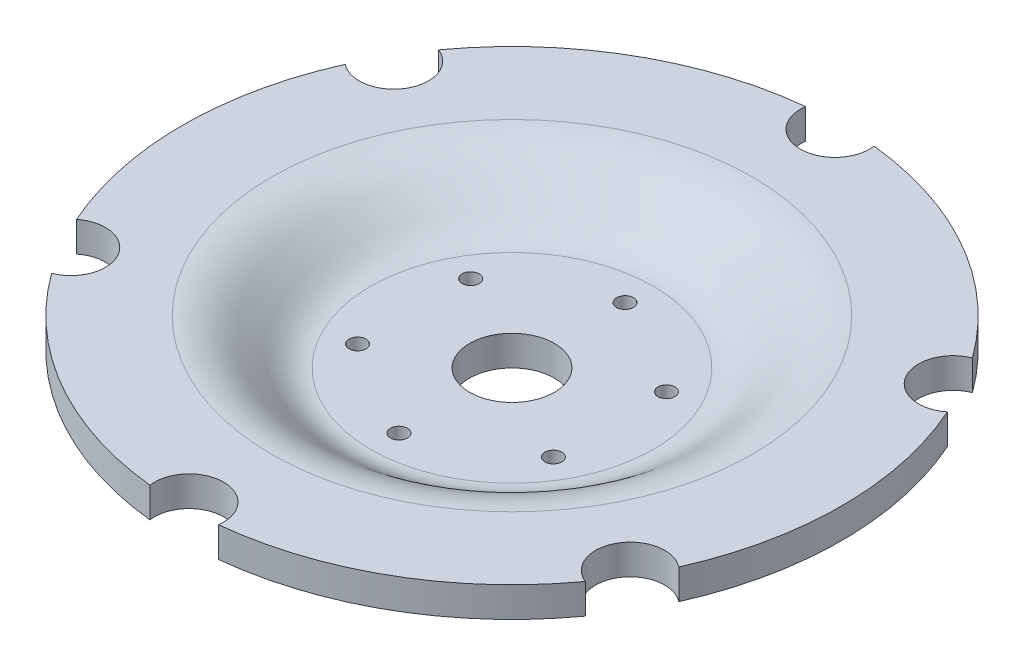
ISO-10303-21;
HEADER;
FILE_DESCRIPTION(('STEP AP214'),'2;1');
FILE_NAME('part.step','',(''),(''),'','','');
FILE_SCHEMA(('AUTOMOTIVE_DESIGN { 1 0 10303 214 1 1 1 1 }'));
ENDSEC;
DATA;
#1=APPLICATION_CONTEXT('core data for automotive mechanical design processes');
#2=APPLICATION_PROTOCOL_DEFINITION('international standard','automotive_design',2000,#1);
#3=PRODUCT_CONTEXT('',#1,'mechanical');
#4=PRODUCT('Part','Part','',(#3));
#5=PRODUCT_RELATED_PRODUCT_CATEGORY('part','',(#4));
#6=PRODUCT_DEFINITION_FORMATION('','',#4);
#7=PRODUCT_DEFINITION_CONTEXT('part definition',#1,'design');
#8=PRODUCT_DEFINITION('design','',#6,#7);
#9=PRODUCT_DEFINITION_SHAPE('','',#8);
#10=(LENGTH_UNIT() NAMED_UNIT(*) SI_UNIT(.MILLI.,.METRE.));
#11=(NAMED_UNIT(*) PLANE_ANGLE_UNIT() SI_UNIT($,.RADIAN.));
#12=(NAMED_UNIT(*) SI_UNIT($,.STERADIAN.) SOLID_ANGLE_UNIT());
#13=UNCERTAINTY_MEASURE_WITH_UNIT(LENGTH_MEASURE(1.E-05),#10,'distance_accuracy_value','');
#14=(GEOMETRIC_REPRESENTATION_CONTEXT(3) GLOBAL_UNCERTAINTY_ASSIGNED_CONTEXT((#13)) GLOBAL_UNIT_ASSIGNED_CONTEXT((#10,
#11,#12)) REPRESENTATION_CONTEXT('',''));
#15=CARTESIAN_POINT('',(0.,0.,0.));
#16=DIRECTION('',(0.,0.,1.));
#17=DIRECTION('',(1.,0.,0.));
#18=AXIS2_PLACEMENT_3D('',#15,#16,#17);
#19=CARTESIAN_POINT('',(0.,-15.0433244229354,0.));
#20=DIRECTION('',(0.,1.,0.));
#21=DIRECTION('',(0.,0.,1.));
#22=AXIS2_PLACEMENT_3D('',#19,#20,#21);
#23=CYLINDRICAL_SURFACE('',#22,109.626011544447);
#24=DIRECTION('',(0.,1.,0.));
#25=VECTOR('',#24,1.);
#26=CARTESIAN_POINT('',(-100.116479710272,-8.76000000000002,-44.6604175704388));
#27=LINE('',#26,#25);
#28=CARTESIAN_POINT('',(-100.116479710272,-6.24000000000001,-44.6604175704389));
#29=VERTEX_POINT('',#28);
#30=CARTESIAN_POINT('',(-100.116479710272,3.75999999999999,-44.6604175704389));
#31=VERTEX_POINT('',#30);
#32=EDGE_CURVE('E55',#29,#31,#27,.T.);
#33=ORIENTED_EDGE('',*,*,#32,.F.);
#34=CARTESIAN_POINT('',(0.,-6.24,0.));
#35=DIRECTION('',(0.,1.,0.));
#36=DIRECTION('',(0.,0.,1.));
#37=AXIS2_PLACEMENT_3D('',#34,#35,#36);
#38=CIRCLE('',#37,109.626011544447);
#39=CARTESIAN_POINT('',(-100.11647971027,-6.24,44.6604175704429));
#40=VERTEX_POINT('',#39);
#41=EDGE_CURVE('E167',#29,#40,#38,.T.);
#42=ORIENTED_EDGE('',*,*,#41,.T.);
#43=DIRECTION('',(0.,1.,0.));
#44=VECTOR('',#43,1.);
#45=CARTESIAN_POINT('',(-100.11647971027,-8.76,44.6604175704429));
#46=LINE('',#45,#44);
#47=CARTESIAN_POINT('',(-100.11647971027,3.76000000000001,44.6604175704429));
#48=VERTEX_POINT('',#47);
#49=EDGE_CURVE('E201',#48,#40,#46,.F.);
#50=ORIENTED_EDGE('',*,*,#49,.F.);
#51=CARTESIAN_POINT('',(0.,3.76,0.));
#52=DIRECTION('',(0.,1.,0.));
#53=DIRECTION('',(0.,0.,1.));
#54=AXIS2_PLACEMENT_3D('',#51,#52,#53);
#55=CIRCLE('',#54,109.626011544447);
#56=EDGE_CURVE('E150',#31,#48,#55,.T.);
#57=ORIENTED_EDGE('',*,*,#56,.F.);
#58=EDGE_LOOP('',(#33,#42,#50,#57));
#59=FACE_BOUND('',#58,.T.);
#60=ADVANCED_FACE('F41',(#59),#23,.T.);
#61=DIRECTION('',(0.,1.,0.));
#62=VECTOR('',#61,1.);
#63=CARTESIAN_POINT('',(100.116479710273,-8.76,44.6604175704364));
#64=LINE('',#63,#62);
#65=CARTESIAN_POINT('',(100.116479710273,-6.23999999999999,44.6604175704365));
#66=VERTEX_POINT('',#65);
#67=CARTESIAN_POINT('',(100.116479710273,3.76000000000001,44.6604175704365));
#68=VERTEX_POINT('',#67);
#69=EDGE_CURVE('E63',#66,#68,#64,.T.);
#70=ORIENTED_EDGE('',*,*,#69,.F.);
#71=CARTESIAN_POINT('',(100.116479710271,-6.24000000000001,-44.6604175704404));
#72=VERTEX_POINT('',#71);
#73=EDGE_CURVE('E187',#66,#72,#38,.T.);
#74=ORIENTED_EDGE('',*,*,#73,.T.);
#75=DIRECTION('',(0.,1.,0.));
#76=VECTOR('',#75,1.);
#77=CARTESIAN_POINT('',(100.116479710271,-8.76000000000002,-44.6604175704404));
#78=LINE('',#77,#76);
#79=CARTESIAN_POINT('',(100.116479710271,3.75999999999999,-44.6604175704404));
#80=VERTEX_POINT('',#79);
#81=EDGE_CURVE('E179',#80,#72,#78,.F.);
#82=ORIENTED_EDGE('',*,*,#81,.F.);
#83=EDGE_CURVE('E153',#68,#80,#55,.T.);
#84=ORIENTED_EDGE('',*,*,#83,.F.);
#85=EDGE_LOOP('',(#70,#74,#82,#84));
#86=FACE_BOUND('',#85,.T.);
#87=ADVANCED_FACE('F185',(#86),#23,.T.);
#88=DIRECTION('',(0.,1.,0.));
#89=VECTOR('',#88,1.);
#90=CARTESIAN_POINT('',(88.7352960147567,-8.76000000000002,-64.3732059813459));
#91=LINE('',#90,#89);
#92=CARTESIAN_POINT('',(88.7352960147567,-6.24000000000001,-64.3732059813458));
#93=VERTEX_POINT('',#92);
#94=CARTESIAN_POINT('',(88.7352960147567,3.75999999999999,-64.3732059813458));
#95=VERTEX_POINT('',#94);
#96=EDGE_CURVE('E182',#93,#95,#91,.T.);
#97=ORIENTED_EDGE('',*,*,#96,.F.);
#98=CARTESIAN_POINT('',(11.3811836955142,-6.24000000000002,-109.033623551784));
#99=VERTEX_POINT('',#98);
#100=EDGE_CURVE('E271',#93,#99,#38,.T.);
#101=ORIENTED_EDGE('',*,*,#100,.T.);
#102=DIRECTION('',(0.,1.,0.));
#103=VECTOR('',#102,1.);
#104=CARTESIAN_POINT('',(11.3811836955142,-8.76000000000003,-109.033623551784));
#105=LINE('',#104,#103);
#106=CARTESIAN_POINT('',(11.3811836955142,3.75999999999998,-109.033623551784));
#107=VERTEX_POINT('',#106);
#108=EDGE_CURVE('E282',#107,#99,#105,.F.);
#109=ORIENTED_EDGE('',*,*,#108,.F.);
#110=EDGE_CURVE('E149',#95,#107,#55,.T.);
#111=ORIENTED_EDGE('',*,*,#110,.F.);
#112=EDGE_LOOP('',(#97,#101,#109,#111));
#113=FACE_BOUND('',#112,.T.);
#114=ADVANCED_FACE('F264',(#113),#23,.T.);
#115=DIRECTION('',(0.,1.,0.));
#116=VECTOR('',#115,1.);
#117=CARTESIAN_POINT('',(-88.7352960147583,-8.76000000000002,-64.3732059813435));
#118=LINE('',#117,#116);
#119=CARTESIAN_POINT('',(-88.7352960147583,3.75999999999999,-64.3732059813435));
#120=VERTEX_POINT('',#119);
#121=CARTESIAN_POINT('',(-88.7352960147583,-6.24000000000001,-64.3732059813436));
#122=VERTEX_POINT('',#121);
#123=EDGE_CURVE('E128',#120,#122,#118,.F.);
#124=ORIENTED_EDGE('',*,*,#123,.F.);
#125=CARTESIAN_POINT('',(-11.3811836955142,3.75999999999998,-109.033623551784));
#126=VERTEX_POINT('',#125);
#127=EDGE_CURVE('E138',#126,#120,#55,.T.);
#128=ORIENTED_EDGE('',*,*,#127,.F.);
#129=DIRECTION('',(0.,1.,0.));
#130=VECTOR('',#129,1.);
#131=CARTESIAN_POINT('',(-11.3811836955142,-8.76000000000003,-109.033623551784));
#132=LINE('',#131,#130);
#133=CARTESIAN_POINT('',(-11.3811836955142,-6.24000000000002,-109.033623551784));
#134=VERTEX_POINT('',#133);
#135=EDGE_CURVE('E183',#134,#126,#132,.T.);
#136=ORIENTED_EDGE('',*,*,#135,.F.);
#137=EDGE_CURVE('E140',#134,#122,#38,.T.);
#138=ORIENTED_EDGE('',*,*,#137,.T.);
#139=EDGE_LOOP('',(#124,#128,#136,#138));
#140=FACE_BOUND('',#139,.T.);
#141=ADVANCED_FACE('F136',(#140),#23,.T.);
#142=DIRECTION('',(0.,1.,0.));
#143=VECTOR('',#142,1.);
#144=CARTESIAN_POINT('',(-88.7352960147557,-8.76,64.3732059813472));
#145=LINE('',#144,#143);
#146=CARTESIAN_POINT('',(-88.7352960147557,-6.23999999999999,64.3732059813472));
#147=VERTEX_POINT('',#146);
#148=CARTESIAN_POINT('',(-88.7352960147557,3.76000000000001,64.3732059813472));
#149=VERTEX_POINT('',#148);
#150=EDGE_CURVE('E206',#147,#149,#145,.T.);
#151=ORIENTED_EDGE('',*,*,#150,.F.);
#152=CARTESIAN_POINT('',(-11.3811836954952,-6.23999999999998,109.033623551786));
#153=VERTEX_POINT('',#152);
#154=EDGE_CURVE('E165',#147,#153,#38,.T.);
#155=ORIENTED_EDGE('',*,*,#154,.T.);
#156=DIRECTION('',(0.,1.,0.));
#157=VECTOR('',#156,1.);
#158=CARTESIAN_POINT('',(-11.3811836954952,-8.75999999999999,109.033623551786));
#159=LINE('',#158,#157);
#160=CARTESIAN_POINT('',(-11.3811836954952,3.76000000000002,109.033623551786));
#161=VERTEX_POINT('',#160);
#162=EDGE_CURVE('E210',#161,#153,#159,.F.);
#163=ORIENTED_EDGE('',*,*,#162,.F.);
#164=EDGE_CURVE('E152',#149,#161,#55,.T.);
#165=ORIENTED_EDGE('',*,*,#164,.F.);
#166=EDGE_LOOP('',(#151,#155,#163,#165));
#167=FACE_BOUND('',#166,.T.);
#168=ADVANCED_FACE('F243',(#167),#23,.T.);
#169=CARTESIAN_POINT('',(0.,-11.28,0.));
#170=DIRECTION('',(0.,1.,0.));
#171=DIRECTION('',(0.,0.,1.));
#172=AXIS2_PLACEMENT_3D('',#169,#170,#171);
#173=PLANE('',#172);
#174=CARTESIAN_POINT('',(0.,-11.28,0.));
#175=DIRECTION('',(0.,1.,0.));
#176=DIRECTION('',(0.,0.,1.));
#177=AXIS2_PLACEMENT_3D('',#174,#175,#176);
#178=CIRCLE('',#177,14.1);
#179=CARTESIAN_POINT('',(0.,-11.28,14.1));
#180=VERTEX_POINT('',#179);
#181=EDGE_CURVE('E351',#180,#180,#178,.T.);
#182=ORIENTED_EDGE('',*,*,#181,.F.);
#183=EDGE_LOOP('',(#182));
#184=FACE_BOUND('',#183,.T.);
#185=CARTESIAN_POINT('',(-32.5625551822947,-11.28,-18.8000000000004));
#186=DIRECTION('',(0.,1.,0.));
#187=DIRECTION('',(0.,0.,1.));
#188=AXIS2_PLACEMENT_3D('',#185,#186,#187);
#189=CIRCLE('',#188,2.81999999999999);
#190=CARTESIAN_POINT('',(-32.5625551822947,-11.28,-15.9800000000004));
#191=VERTEX_POINT('',#190);
#192=EDGE_CURVE('E346',#191,#191,#189,.T.);
#193=ORIENTED_EDGE('',*,*,#192,.F.);
#194=EDGE_LOOP('',(#193));
#195=FACE_BOUND('',#194,.T.);
#196=CARTESIAN_POINT('',(0.,-11.28,-37.6));
#197=DIRECTION('',(0.,1.,0.));
#198=DIRECTION('',(0.,0.,1.));
#199=AXIS2_PLACEMENT_3D('',#196,#197,#198);
#200=CIRCLE('',#199,2.81999999999999);
#201=CARTESIAN_POINT('',(0.,-11.28,-34.78));
#202=VERTEX_POINT('',#201);
#203=EDGE_CURVE('E340',#202,#202,#200,.T.);
#204=ORIENTED_EDGE('',*,*,#203,.F.);
#205=EDGE_LOOP('',(#204));
#206=FACE_BOUND('',#205,.T.);
#207=CARTESIAN_POINT('',(32.562555182295,-11.28,-18.8));
#208=DIRECTION('',(0.,1.,0.));
#209=DIRECTION('',(0.,0.,1.));
#210=AXIS2_PLACEMENT_3D('',#207,#208,#209);
#211=CIRCLE('',#210,2.81999999999999);
#212=CARTESIAN_POINT('',(32.562555182295,-11.28,-15.98));
#213=VERTEX_POINT('',#212);
#214=EDGE_CURVE('E334',#213,#213,#211,.T.);
#215=ORIENTED_EDGE('',*,*,#214,.F.);
#216=EDGE_LOOP('',(#215));
#217=FACE_BOUND('',#216,.T.);
#218=CARTESIAN_POINT('',(32.5625551822981,-11.28,18.7999999999981));
#219=DIRECTION('',(0.,1.,0.));
#220=DIRECTION('',(0.,0.,1.));
#221=AXIS2_PLACEMENT_3D('',#218,#219,#220);
#222=CIRCLE('',#221,2.81999999999999);
#223=CARTESIAN_POINT('',(32.5625551822981,-11.28,21.6199999999981));
#224=VERTEX_POINT('',#223);
#225=EDGE_CURVE('E328',#224,#224,#222,.T.);
#226=ORIENTED_EDGE('',*,*,#225,.F.);
#227=EDGE_LOOP('',(#226));
#228=FACE_BOUND('',#227,.T.);
#229=CARTESIAN_POINT('',(4.26541575440318E-12,-11.28,37.6));
#230=DIRECTION('',(0.,1.,0.));
#231=DIRECTION('',(0.,0.,1.));
#232=AXIS2_PLACEMENT_3D('',#229,#230,#231);
#233=CIRCLE('',#232,2.81999999999999);
#234=CARTESIAN_POINT('',(4.26541575440318E-12,-11.28,40.42));
#235=VERTEX_POINT('',#234);
#236=EDGE_CURVE('E322',#235,#235,#233,.T.);
#237=ORIENTED_EDGE('',*,*,#236,.F.);
#238=EDGE_LOOP('',(#237));
#239=FACE_BOUND('',#238,.T.);
#240=CARTESIAN_POINT('',(-32.5625551822917,-11.28,18.8000000000019));
#241=DIRECTION('',(0.,1.,0.));
#242=DIRECTION('',(0.,0.,1.));
#243=AXIS2_PLACEMENT_3D('',#240,#241,#242);
#244=CIRCLE('',#243,2.81999999999999);
#245=CARTESIAN_POINT('',(-32.5625551822917,-11.28,21.6200000000018));
#246=VERTEX_POINT('',#245);
#247=EDGE_CURVE('E316',#246,#246,#244,.T.);
#248=ORIENTED_EDGE('',*,*,#247,.F.);
#249=EDGE_LOOP('',(#248));
#250=FACE_BOUND('',#249,.T.);
#251=CARTESIAN_POINT('',(0.,-11.28,0.));
#252=DIRECTION('',(0.,1.,0.));
#253=DIRECTION('',(0.,0.,1.));
#254=AXIS2_PLACEMENT_3D('',#251,#252,#253);
#255=CIRCLE('',#254,47.);
#256=CARTESIAN_POINT('',(0.,-11.28,47.));
#257=VERTEX_POINT('',#256);
#258=EDGE_CURVE('E163',#257,#257,#255,.T.);
#259=ORIENTED_EDGE('',*,*,#258,.T.);
#260=EDGE_LOOP('',(#259));
#261=FACE_BOUND('',#260,.T.);
#262=ADVANCED_FACE('F43',(#184,#195,#206,#217,#228,#239,#250,#261),#173,.T.);
#263=CARTESIAN_POINT('',(0.,-21.28,0.));
#264=DIRECTION('',(0.,-1.,0.));
#265=DIRECTION('',(0.,0.,-1.));
#266=AXIS2_PLACEMENT_3D('',#263,#264,#265);
#267=PLANE('',#266);
#268=CARTESIAN_POINT('',(0.,-21.28,0.));
#269=DIRECTION('',(0.,1.,0.));
#270=DIRECTION('',(0.,0.,1.));
#271=AXIS2_PLACEMENT_3D('',#268,#269,#270);
#272=CIRCLE('',#271,14.1);
#273=CARTESIAN_POINT('',(0.,-21.28,14.1));
#274=VERTEX_POINT('',#273);
#275=EDGE_CURVE('E349',#274,#274,#272,.T.);
#276=ORIENTED_EDGE('',*,*,#275,.T.);
#277=EDGE_LOOP('',(#276));
#278=FACE_BOUND('',#277,.T.);
#279=CARTESIAN_POINT('',(-32.5625551822947,-21.28,-18.8000000000004));
#280=DIRECTION('',(0.,1.,0.));
#281=DIRECTION('',(0.,0.,1.));
#282=AXIS2_PLACEMENT_3D('',#279,#280,#281);
#283=CIRCLE('',#282,2.82);
#284=CARTESIAN_POINT('',(-32.5625551822947,-21.28,-15.9800000000004));
#285=VERTEX_POINT('',#284);
#286=EDGE_CURVE('E343',#285,#285,#283,.T.);
#287=ORIENTED_EDGE('',*,*,#286,.T.);
#288=EDGE_LOOP('',(#287));
#289=FACE_BOUND('',#288,.T.);
#290=CARTESIAN_POINT('',(0.,-21.28,-37.6));
#291=DIRECTION('',(0.,1.,0.));
#292=DIRECTION('',(0.,0.,1.));
#293=AXIS2_PLACEMENT_3D('',#290,#291,#292);
#294=CIRCLE('',#293,2.82);
#295=CARTESIAN_POINT('',(0.,-21.28,-34.78));
#296=VERTEX_POINT('',#295);
#297=EDGE_CURVE('E337',#296,#296,#294,.T.);
#298=ORIENTED_EDGE('',*,*,#297,.T.);
#299=EDGE_LOOP('',(#298));
#300=FACE_BOUND('',#299,.T.);
#301=CARTESIAN_POINT('',(32.562555182295,-21.28,-18.8));
#302=DIRECTION('',(0.,1.,0.));
#303=DIRECTION('',(0.,0.,1.));
#304=AXIS2_PLACEMENT_3D('',#301,#302,#303);
#305=CIRCLE('',#304,2.82);
#306=CARTESIAN_POINT('',(32.562555182295,-21.28,-15.98));
#307=VERTEX_POINT('',#306);
#308=EDGE_CURVE('E331',#307,#307,#305,.T.);
#309=ORIENTED_EDGE('',*,*,#308,.T.);
#310=EDGE_LOOP('',(#309));
#311=FACE_BOUND('',#310,.T.);
#312=CARTESIAN_POINT('',(32.5625551822981,-21.28,18.7999999999981));
#313=DIRECTION('',(0.,1.,0.));
#314=DIRECTION('',(0.,0.,1.));
#315=AXIS2_PLACEMENT_3D('',#312,#313,#314);
#316=CIRCLE('',#315,2.82);
#317=CARTESIAN_POINT('',(32.5625551822981,-21.28,21.6199999999981));
#318=VERTEX_POINT('',#317);
#319=EDGE_CURVE('E325',#318,#318,#316,.T.);
#320=ORIENTED_EDGE('',*,*,#319,.T.);
#321=EDGE_LOOP('',(#320));
#322=FACE_BOUND('',#321,.T.);
#323=CARTESIAN_POINT('',(4.26541575440318E-12,-21.28,37.6));
#324=DIRECTION('',(0.,1.,0.));
#325=DIRECTION('',(0.,0.,1.));
#326=AXIS2_PLACEMENT_3D('',#323,#324,#325);
#327=CIRCLE('',#326,2.82);
#328=CARTESIAN_POINT('',(4.26541575440318E-12,-21.28,40.42));
#329=VERTEX_POINT('',#328);
#330=EDGE_CURVE('E319',#329,#329,#327,.T.);
#331=ORIENTED_EDGE('',*,*,#330,.T.);
#332=EDGE_LOOP('',(#331));
#333=FACE_BOUND('',#332,.T.);
#334=CARTESIAN_POINT('',(-32.5625551822917,-21.28,18.8000000000019));
#335=DIRECTION('',(0.,1.,0.));
#336=DIRECTION('',(0.,0.,1.));
#337=AXIS2_PLACEMENT_3D('',#334,#335,#336);
#338=CIRCLE('',#337,2.82);
#339=CARTESIAN_POINT('',(-32.5625551822917,-21.28,21.6200000000018));
#340=VERTEX_POINT('',#339);
#341=EDGE_CURVE('E142',#340,#340,#338,.T.);
#342=ORIENTED_EDGE('',*,*,#341,.T.);
#343=EDGE_LOOP('',(#342));
#344=FACE_BOUND('',#343,.T.);
#345=CARTESIAN_POINT('',(0.,-21.28,0.));
#346=DIRECTION('',(0.,1.,0.));
#347=DIRECTION('',(0.,0.,1.));
#348=AXIS2_PLACEMENT_3D('',#345,#346,#347);
#349=CIRCLE('',#348,47.0000000000002);
#350=CARTESIAN_POINT('',(0.,-21.28,47.0000000000002));
#351=VERTEX_POINT('',#350);
#352=EDGE_CURVE('E279',#351,#351,#349,.T.);
#353=ORIENTED_EDGE('',*,*,#352,.F.);
#354=EDGE_LOOP('',(#353));
#355=FACE_BOUND('',#354,.T.);
#356=ADVANCED_FACE('F249',(#278,#289,#300,#311,#322,#333,#344,#355),#267,.T.);
#357=CARTESIAN_POINT('',(79.9,-6.24,0.));
#358=CARTESIAN_POINT('',(79.5814219048359,-6.24,0.));
#359=CARTESIAN_POINT('',(78.9274629999967,-6.26135514550307,0.));
#360=CARTESIAN_POINT('',(77.7578426696443,-6.37664196986913,0.));
#361=CARTESIAN_POINT('',(76.3667583016656,-6.65192998526286,0.));
#362=CARTESIAN_POINT('',(74.8239491144071,-7.16288550630177,0.));
#363=CARTESIAN_POINT('',(72.7883973936226,-8.09443504718028,0.));
#364=CARTESIAN_POINT('',(70.2209148985642,-9.72699602605355,0.));
#365=CARTESIAN_POINT('',(66.9206940326988,-12.3328310892076,0.));
#366=CARTESIAN_POINT('',(63.2491847703619,-15.3017782132427,0.));
#367=CARTESIAN_POINT('',(59.6386253805314,-17.7605205155428,0.));
#368=CARTESIAN_POINT('',(56.2437732055035,-19.4391988412004,0.));
#369=CARTESIAN_POINT('',(53.4143313725907,-20.4534612437412,0.));
#370=CARTESIAN_POINT('',(50.3552086088509,-21.1198170005363,0.));
#371=CARTESIAN_POINT('',(48.1033977983843,-21.28,0.));
#372=CARTESIAN_POINT('',(47.0000000000002,-21.28,0.));
#373=B_SPLINE_CURVE_WITH_KNOTS('',3,(#357,#358,#359,#360,#361,#362,#363,#364,#365,#366,#367,
#368,#369,#370,#371,#372),.UNSPECIFIED.,.F.,.F.,(4,1,1,1,1,1,1,1,1,1,1,1,1,4),(0.,0.03125,
0.0625,0.125,0.1875,0.25,0.375,0.5,0.625,0.75,0.8125,0.875,0.9375,1.),.UNSPECIFIED.);
#374=CARTESIAN_POINT('',(0.,-15.0433244229354,0.));
#375=DIRECTION('',(0.,1.,0.));
#376=AXIS1_PLACEMENT('',#374,#375);
#377=SURFACE_OF_REVOLUTION('',#373,#376);
#378=ORIENTED_EDGE('',*,*,#352,.T.);
#379=EDGE_LOOP('',(#378));
#380=FACE_BOUND('',#379,.T.);
#381=CARTESIAN_POINT('',(0.,-6.24,0.));
#382=DIRECTION('',(0.,1.,0.));
#383=DIRECTION('',(0.,0.,1.));
#384=AXIS2_PLACEMENT_3D('',#381,#382,#383);
#385=CIRCLE('',#384,79.9);
#386=CARTESIAN_POINT('',(0.,-6.23999999999999,79.9));
#387=VERTEX_POINT('',#386);
#388=EDGE_CURVE('E274',#387,#387,#385,.T.);
#389=ORIENTED_EDGE('',*,*,#388,.F.);
#390=EDGE_LOOP('',(#389));
#391=FACE_BOUND('',#390,.T.);
#392=ADVANCED_FACE('F246',(#380,#391),#377,.F.);
#393=CARTESIAN_POINT('',(79.9,-6.24,0.));
#394=DIRECTION('',(0.,-1.,0.));
#395=DIRECTION('',(0.,0.,-1.));
#396=AXIS2_PLACEMENT_3D('',#393,#394,#395);
#397=PLANE('',#396);
#398=CARTESIAN_POINT('',(-92.9979546474359,-6.24000000000001,-53.6923941497804));
#399=DIRECTION('',(0.,-1.,0.));
#400=DIRECTION('',(0.,0.,-1.));
#401=AXIS2_PLACEMENT_3D('',#398,#399,#400);
#402=CIRCLE('',#401,11.5);
#403=EDGE_CURVE('E141',#122,#29,#402,.T.);
#404=ORIENTED_EDGE('',*,*,#403,.F.);
#405=ORIENTED_EDGE('',*,*,#137,.F.);
#406=CARTESIAN_POINT('',(0.,-6.24000000000002,-107.384788299565));
#407=DIRECTION('',(0.,-1.,0.));
#408=DIRECTION('',(0.,0.,-1.));
#409=AXIS2_PLACEMENT_3D('',#406,#407,#408);
#410=CIRCLE('',#409,11.5);
#411=EDGE_CURVE('E196',#99,#134,#410,.T.);
#412=ORIENTED_EDGE('',*,*,#411,.F.);
#413=ORIENTED_EDGE('',*,*,#100,.F.);
#414=CARTESIAN_POINT('',(92.997954647438,-6.24000000000001,-53.6923941497842));
#415=DIRECTION('',(0.,-1.,0.));
#416=DIRECTION('',(0.,0.,-1.));
#417=AXIS2_PLACEMENT_3D('',#414,#415,#416);
#418=CIRCLE('',#417,11.5);
#419=EDGE_CURVE('E188',#72,#93,#418,.T.);
#420=ORIENTED_EDGE('',*,*,#419,.F.);
#421=ORIENTED_EDGE('',*,*,#73,.F.);
#422=CARTESIAN_POINT('',(92.9979546474402,-6.23999999999999,53.6923941497805));
#423=DIRECTION('',(0.,-1.,0.));
#424=DIRECTION('',(0.,0.,-1.));
#425=AXIS2_PLACEMENT_3D('',#422,#423,#424);
#426=CIRCLE('',#425,11.5);
#427=CARTESIAN_POINT('',(88.7352960147592,-6.23999999999999,64.3732059813423));
#428=VERTEX_POINT('',#427);
#429=EDGE_CURVE('E191',#428,#66,#426,.T.);
#430=ORIENTED_EDGE('',*,*,#429,.F.);
#431=CARTESIAN_POINT('',(11.3811836955352,-6.23999999999999,109.033623551782));
#432=VERTEX_POINT('',#431);
#433=EDGE_CURVE('E168',#432,#428,#38,.T.);
#434=ORIENTED_EDGE('',*,*,#433,.F.);
#435=CARTESIAN_POINT('',(1.96214344722274E-11,-6.23999999999999,107.384788299571));
#436=DIRECTION('',(0.,-1.,0.));
#437=DIRECTION('',(0.,0.,-1.));
#438=AXIS2_PLACEMENT_3D('',#435,#436,#437);
#439=CIRCLE('',#438,11.5);
#440=EDGE_CURVE('E213',#153,#432,#439,.T.);
#441=ORIENTED_EDGE('',*,*,#440,.F.);
#442=ORIENTED_EDGE('',*,*,#154,.F.);
#443=CARTESIAN_POINT('',(-92.9979546474337,-6.23999999999999,53.6923941497842));
#444=DIRECTION('',(0.,-1.,0.));
#445=DIRECTION('',(0.,0.,-1.));
#446=AXIS2_PLACEMENT_3D('',#443,#444,#445);
#447=CIRCLE('',#446,11.5);
#448=EDGE_CURVE('E204',#40,#147,#447,.T.);
#449=ORIENTED_EDGE('',*,*,#448,.F.);
#450=ORIENTED_EDGE('',*,*,#41,.F.);
#451=EDGE_LOOP('',(#404,#405,#412,#413,#420,#421,#430,#434,#441,#442,#449,#450));
#452=FACE_BOUND('',#451,.T.);
#453=ORIENTED_EDGE('',*,*,#388,.T.);
#454=EDGE_LOOP('',(#453));
#455=FACE_BOUND('',#454,.T.);
#456=ADVANCED_FACE('F241',(#452,#455),#397,.T.);
#457=DIRECTION('',(0.,1.,0.));
#458=VECTOR('',#457,1.);
#459=CARTESIAN_POINT('',(88.7352960147592,-8.76,64.3732059813423));
#460=LINE('',#459,#458);
#461=CARTESIAN_POINT('',(88.7352960147592,3.76000000000001,64.3732059813423));
#462=VERTEX_POINT('',#461);
#463=EDGE_CURVE('E308',#462,#428,#460,.F.);
#464=ORIENTED_EDGE('',*,*,#463,.F.);
#465=CARTESIAN_POINT('',(11.3811836955352,3.76000000000002,109.033623551782));
#466=VERTEX_POINT('',#465);
#467=EDGE_CURVE('E154',#466,#462,#55,.T.);
#468=ORIENTED_EDGE('',*,*,#467,.F.);
#469=DIRECTION('',(0.,1.,0.));
#470=VECTOR('',#469,1.);
#471=CARTESIAN_POINT('',(11.3811836955351,-8.75999999999999,109.033623551782));
#472=LINE('',#471,#470);
#473=EDGE_CURVE('E215',#432,#466,#472,.T.);
#474=ORIENTED_EDGE('',*,*,#473,.F.);
#475=ORIENTED_EDGE('',*,*,#433,.T.);
#476=EDGE_LOOP('',(#464,#468,#474,#475));
#477=FACE_BOUND('',#476,.T.);
#478=ADVANCED_FACE('F238',(#477),#23,.T.);
#479=CARTESIAN_POINT('',(79.9,3.76,0.));
#480=DIRECTION('',(0.,1.,0.));
#481=DIRECTION('',(0.,0.,1.));
#482=AXIS2_PLACEMENT_3D('',#479,#480,#481);
#483=PLANE('',#482);
#484=CARTESIAN_POINT('',(-92.9979546474359,3.75999999999999,-53.6923941497804));
#485=DIRECTION('',(0.,1.,0.));
#486=DIRECTION('',(0.,0.,1.));
#487=AXIS2_PLACEMENT_3D('',#484,#485,#486);
#488=CIRCLE('',#487,11.5);
#489=EDGE_CURVE('E11',#31,#120,#488,.T.);
#490=ORIENTED_EDGE('',*,*,#489,.F.);
#491=ORIENTED_EDGE('',*,*,#56,.T.);
#492=CARTESIAN_POINT('',(-92.9979546474337,3.76000000000001,53.6923941497842));
#493=DIRECTION('',(0.,1.,0.));
#494=DIRECTION('',(0.,0.,1.));
#495=AXIS2_PLACEMENT_3D('',#492,#493,#494);
#496=CIRCLE('',#495,11.5);
#497=EDGE_CURVE('E198',#149,#48,#496,.T.);
#498=ORIENTED_EDGE('',*,*,#497,.F.);
#499=ORIENTED_EDGE('',*,*,#164,.T.);
#500=CARTESIAN_POINT('',(1.96214344722274E-11,3.76000000000002,107.384788299571));
#501=DIRECTION('',(0.,1.,0.));
#502=DIRECTION('',(0.,0.,1.));
#503=AXIS2_PLACEMENT_3D('',#500,#501,#502);
#504=CIRCLE('',#503,11.5);
#505=EDGE_CURVE('E208',#466,#161,#504,.T.);
#506=ORIENTED_EDGE('',*,*,#505,.F.);
#507=ORIENTED_EDGE('',*,*,#467,.T.);
#508=CARTESIAN_POINT('',(92.9979546474402,3.76000000000001,53.6923941497805));
#509=DIRECTION('',(0.,1.,0.));
#510=DIRECTION('',(0.,0.,1.));
#511=AXIS2_PLACEMENT_3D('',#508,#509,#510);
#512=CIRCLE('',#511,11.5);
#513=EDGE_CURVE('E173',#68,#462,#512,.T.);
#514=ORIENTED_EDGE('',*,*,#513,.F.);
#515=ORIENTED_EDGE('',*,*,#83,.T.);
#516=CARTESIAN_POINT('',(92.997954647438,3.75999999999999,-53.6923941497842));
#517=DIRECTION('',(0.,1.,0.));
#518=DIRECTION('',(0.,0.,1.));
#519=AXIS2_PLACEMENT_3D('',#516,#517,#518);
#520=CIRCLE('',#519,11.5);
#521=EDGE_CURVE('E49',#95,#80,#520,.T.);
#522=ORIENTED_EDGE('',*,*,#521,.F.);
#523=ORIENTED_EDGE('',*,*,#110,.T.);
#524=CARTESIAN_POINT('',(0.,3.75999999999998,-107.384788299565));
#525=DIRECTION('',(0.,1.,0.));
#526=DIRECTION('',(0.,0.,1.));
#527=AXIS2_PLACEMENT_3D('',#524,#525,#526);
#528=CIRCLE('',#527,11.5);
#529=EDGE_CURVE('E148',#126,#107,#528,.T.);
#530=ORIENTED_EDGE('',*,*,#529,.F.);
#531=ORIENTED_EDGE('',*,*,#127,.T.);
#532=EDGE_LOOP('',(#490,#491,#498,#499,#506,#507,#514,#515,#522,#523,#530,#531));
#533=FACE_BOUND('',#532,.T.);
#534=CARTESIAN_POINT('',(0.,3.76,0.));
#535=DIRECTION('',(0.,1.,0.));
#536=DIRECTION('',(0.,0.,1.));
#537=AXIS2_PLACEMENT_3D('',#534,#535,#536);
#538=CIRCLE('',#537,79.9);
#539=CARTESIAN_POINT('',(0.,3.76000000000001,79.9));
#540=VERTEX_POINT('',#539);
#541=EDGE_CURVE('E157',#540,#540,#538,.T.);
#542=ORIENTED_EDGE('',*,*,#541,.F.);
#543=EDGE_LOOP('',(#542));
#544=FACE_BOUND('',#543,.T.);
#545=ADVANCED_FACE('F145',(#533,#544),#483,.T.);
#546=CARTESIAN_POINT('',(47.,-11.28,0.));
#547=CARTESIAN_POINT('',(47.3237606234799,-11.28,0.));
#548=CARTESIAN_POINT('',(47.9824273995364,-11.2568011836151,0.));
#549=CARTESIAN_POINT('',(49.2058814811947,-11.1253375384842,0.));
#550=CARTESIAN_POINT('',(50.6524730385144,-10.8134604628352,0.));
#551=CARTESIAN_POINT('',(52.3036344875106,-10.2235996038593,0.));
#552=CARTESIAN_POINT('',(54.4659042580729,-9.16305009894689,0.));
#553=CARTESIAN_POINT('',(57.1691398201527,-7.35071188742741,0.));
#554=CARTESIAN_POINT('',(60.5597732734679,-4.61985367991297,0.));
#555=CARTESIAN_POINT('',(64.2716825606037,-1.67085073742768,0.));
#556=CARTESIAN_POINT('',(67.8471618880741,0.639817329772207,0.));
#557=CARTESIAN_POINT('',(71.1259979901646,2.15110495764982,0.));
#558=CARTESIAN_POINT('',(73.8104306056359,3.04251457067639,0.));
#559=CARTESIAN_POINT('',(76.2432505743064,3.52513130935001,0.));
#560=CARTESIAN_POINT('',(78.2918886877993,3.72549768266214,0.));
#561=CARTESIAN_POINT('',(79.3680087837357,3.76,0.));
#562=CARTESIAN_POINT('',(79.9,3.76,0.));
#563=B_SPLINE_CURVE_WITH_KNOTS('',3,(#546,#547,#548,#549,#550,#551,#552,#553,#554,#555,#556,
#557,#558,#559,#560,#561,#562),.UNSPECIFIED.,.F.,.F.,(4,1,1,1,1,1,1,1,1,1,1,1,1,1,4),(0.,
0.03125,0.0625,0.125,0.1875,0.25,0.375,0.5,0.625,0.75,0.8125,0.875,0.9375,0.96875,1.),.UNSPECIFIED.);
#564=CARTESIAN_POINT('',(0.,-15.0433244229354,0.));
#565=DIRECTION('',(0.,1.,0.));
#566=AXIS1_PLACEMENT('',#564,#565);
#567=SURFACE_OF_REVOLUTION('',#563,#566);
#568=ORIENTED_EDGE('',*,*,#541,.T.);
#569=EDGE_LOOP('',(#568));
#570=FACE_BOUND('',#569,.T.);
#571=ORIENTED_EDGE('',*,*,#258,.F.);
#572=EDGE_LOOP('',(#571));
#573=FACE_BOUND('',#572,.T.);
#574=ADVANCED_FACE('F229',(#570,#573),#567,.F.);
#575=CARTESIAN_POINT('',(1.96214344722274E-11,3.76000000000002,107.384788299571));
#576=DIRECTION('',(0.,1.,0.));
#577=DIRECTION('',(0.,0.,1.));
#578=AXIS2_PLACEMENT_3D('',#575,#576,#577);
#579=CYLINDRICAL_SURFACE('',#578,11.5);
#580=ORIENTED_EDGE('',*,*,#473,.T.);
#581=ORIENTED_EDGE('',*,*,#505,.T.);
#582=ORIENTED_EDGE('',*,*,#162,.T.);
#583=ORIENTED_EDGE('',*,*,#440,.T.);
#584=EDGE_LOOP('',(#580,#581,#582,#583));
#585=FACE_BOUND('',#584,.T.);
#586=ADVANCED_FACE('F233',(#585),#579,.F.);
#587=CARTESIAN_POINT('',(-92.9979546474337,3.76000000000001,53.6923941497842));
#588=DIRECTION('',(0.,1.,0.));
#589=DIRECTION('',(0.,0.,1.));
#590=AXIS2_PLACEMENT_3D('',#587,#588,#589);
#591=CYLINDRICAL_SURFACE('',#590,11.5);
#592=ORIENTED_EDGE('',*,*,#150,.T.);
#593=ORIENTED_EDGE('',*,*,#497,.T.);
#594=ORIENTED_EDGE('',*,*,#49,.T.);
#595=ORIENTED_EDGE('',*,*,#448,.T.);
#596=EDGE_LOOP('',(#592,#593,#594,#595));
#597=FACE_BOUND('',#596,.T.);
#598=ADVANCED_FACE('F395',(#597),#591,.F.);
#599=CARTESIAN_POINT('',(0.,3.75999999999998,-107.384788299565));
#600=DIRECTION('',(0.,1.,0.));
#601=DIRECTION('',(0.,0.,1.));
#602=AXIS2_PLACEMENT_3D('',#599,#600,#601);
#603=CYLINDRICAL_SURFACE('',#602,11.5);
#604=ORIENTED_EDGE('',*,*,#135,.T.);
#605=ORIENTED_EDGE('',*,*,#529,.T.);
#606=ORIENTED_EDGE('',*,*,#108,.T.);
#607=ORIENTED_EDGE('',*,*,#411,.T.);
#608=EDGE_LOOP('',(#604,#605,#606,#607));
#609=FACE_BOUND('',#608,.T.);
#610=ADVANCED_FACE('F287',(#609),#603,.F.);
#611=CARTESIAN_POINT('',(92.997954647438,3.75999999999999,-53.6923941497842));
#612=DIRECTION('',(0.,1.,0.));
#613=DIRECTION('',(0.,0.,1.));
#614=AXIS2_PLACEMENT_3D('',#611,#612,#613);
#615=CYLINDRICAL_SURFACE('',#614,11.5);
#616=ORIENTED_EDGE('',*,*,#96,.T.);
#617=ORIENTED_EDGE('',*,*,#521,.T.);
#618=ORIENTED_EDGE('',*,*,#81,.T.);
#619=ORIENTED_EDGE('',*,*,#419,.T.);
#620=EDGE_LOOP('',(#616,#617,#618,#619));
#621=FACE_BOUND('',#620,.T.);
#622=ADVANCED_FACE('F178',(#621),#615,.F.);
#623=CARTESIAN_POINT('',(92.9979546474402,3.76000000000001,53.6923941497805));
#624=DIRECTION('',(0.,1.,0.));
#625=DIRECTION('',(0.,0.,1.));
#626=AXIS2_PLACEMENT_3D('',#623,#624,#625);
#627=CYLINDRICAL_SURFACE('',#626,11.5);
#628=ORIENTED_EDGE('',*,*,#69,.T.);
#629=ORIENTED_EDGE('',*,*,#513,.T.);
#630=ORIENTED_EDGE('',*,*,#463,.T.);
#631=ORIENTED_EDGE('',*,*,#429,.T.);
#632=EDGE_LOOP('',(#628,#629,#630,#631));
#633=FACE_BOUND('',#632,.T.);
#634=ADVANCED_FACE('F385',(#633),#627,.F.);
#635=CARTESIAN_POINT('',(-92.9979546474359,3.75999999999999,-53.6923941497804));
#636=DIRECTION('',(0.,1.,0.));
#637=DIRECTION('',(0.,0.,1.));
#638=AXIS2_PLACEMENT_3D('',#635,#636,#637);
#639=CYLINDRICAL_SURFACE('',#638,11.5);
#640=ORIENTED_EDGE('',*,*,#32,.T.);
#641=ORIENTED_EDGE('',*,*,#489,.T.);
#642=ORIENTED_EDGE('',*,*,#123,.T.);
#643=ORIENTED_EDGE('',*,*,#403,.T.);
#644=EDGE_LOOP('',(#640,#641,#642,#643));
#645=FACE_BOUND('',#644,.T.);
#646=ADVANCED_FACE('F127',(#645),#639,.F.);
#647=CARTESIAN_POINT('',(-32.5625551822917,-11.28,18.8000000000019));
#648=DIRECTION('',(0.,1.,0.));
#649=DIRECTION('',(0.,0.,1.));
#650=AXIS2_PLACEMENT_3D('',#647,#648,#649);
#651=CYLINDRICAL_SURFACE('',#650,2.81999999999999);
#652=ORIENTED_EDGE('',*,*,#341,.F.);
#653=EDGE_LOOP('',(#652));
#654=FACE_BOUND('',#653,.T.);
#655=ORIENTED_EDGE('',*,*,#247,.T.);
#656=EDGE_LOOP('',(#655));
#657=FACE_BOUND('',#656,.T.);
#658=ADVANCED_FACE('F373',(#654,#657),#651,.F.);
#659=CARTESIAN_POINT('',(4.26541575440318E-12,-11.28,37.6));
#660=DIRECTION('',(0.,1.,0.));
#661=DIRECTION('',(0.,0.,1.));
#662=AXIS2_PLACEMENT_3D('',#659,#660,#661);
#663=CYLINDRICAL_SURFACE('',#662,2.81999999999999);
#664=ORIENTED_EDGE('',*,*,#330,.F.);
#665=EDGE_LOOP('',(#664));
#666=FACE_BOUND('',#665,.T.);
#667=ORIENTED_EDGE('',*,*,#236,.T.);
#668=EDGE_LOOP('',(#667));
#669=FACE_BOUND('',#668,.T.);
#670=ADVANCED_FACE('F375',(#666,#669),#663,.F.);
#671=CARTESIAN_POINT('',(32.5625551822981,-11.28,18.7999999999981));
#672=DIRECTION('',(0.,1.,0.));
#673=DIRECTION('',(0.,0.,1.));
#674=AXIS2_PLACEMENT_3D('',#671,#672,#673);
#675=CYLINDRICAL_SURFACE('',#674,2.81999999999999);
#676=ORIENTED_EDGE('',*,*,#319,.F.);
#677=EDGE_LOOP('',(#676));
#678=FACE_BOUND('',#677,.T.);
#679=ORIENTED_EDGE('',*,*,#225,.T.);
#680=EDGE_LOOP('',(#679));
#681=FACE_BOUND('',#680,.T.);
#682=ADVANCED_FACE('F382',(#678,#681),#675,.F.);
#683=CARTESIAN_POINT('',(32.562555182295,-11.28,-18.8));
#684=DIRECTION('',(0.,1.,0.));
#685=DIRECTION('',(0.,0.,1.));
#686=AXIS2_PLACEMENT_3D('',#683,#684,#685);
#687=CYLINDRICAL_SURFACE('',#686,2.81999999999999);
#688=ORIENTED_EDGE('',*,*,#308,.F.);
#689=EDGE_LOOP('',(#688));
#690=FACE_BOUND('',#689,.T.);
#691=ORIENTED_EDGE('',*,*,#214,.T.);
#692=EDGE_LOOP('',(#691));
#693=FACE_BOUND('',#692,.T.);
#694=ADVANCED_FACE('F534',(#690,#693),#687,.F.);
#695=CARTESIAN_POINT('',(0.,-11.28,-37.6));
#696=DIRECTION('',(0.,1.,0.));
#697=DIRECTION('',(0.,0.,1.));
#698=AXIS2_PLACEMENT_3D('',#695,#696,#697);
#699=CYLINDRICAL_SURFACE('',#698,2.81999999999999);
#700=ORIENTED_EDGE('',*,*,#297,.F.);
#701=EDGE_LOOP('',(#700));
#702=FACE_BOUND('',#701,.T.);
#703=ORIENTED_EDGE('',*,*,#203,.T.);
#704=EDGE_LOOP('',(#703));
#705=FACE_BOUND('',#704,.T.);
#706=ADVANCED_FACE('F544',(#702,#705),#699,.F.);
#707=CARTESIAN_POINT('',(-32.5625551822947,-11.28,-18.8000000000004));
#708=DIRECTION('',(0.,1.,0.));
#709=DIRECTION('',(0.,0.,1.));
#710=AXIS2_PLACEMENT_3D('',#707,#708,#709);
#711=CYLINDRICAL_SURFACE('',#710,2.81999999999999);
#712=ORIENTED_EDGE('',*,*,#286,.F.);
#713=EDGE_LOOP('',(#712));
#714=FACE_BOUND('',#713,.T.);
#715=ORIENTED_EDGE('',*,*,#192,.T.);
#716=EDGE_LOOP('',(#715));
#717=FACE_BOUND('',#716,.T.);
#718=ADVANCED_FACE('F555',(#714,#717),#711,.F.);
#719=CARTESIAN_POINT('',(0.,-11.28,0.));
#720=DIRECTION('',(0.,1.,0.));
#721=DIRECTION('',(0.,0.,1.));
#722=AXIS2_PLACEMENT_3D('',#719,#720,#721);
#723=CYLINDRICAL_SURFACE('',#722,14.1);
#724=ORIENTED_EDGE('',*,*,#275,.F.);
#725=EDGE_LOOP('',(#724));
#726=FACE_BOUND('',#725,.T.);
#727=ORIENTED_EDGE('',*,*,#181,.T.);
#728=EDGE_LOOP('',(#727));
#729=FACE_BOUND('',#728,.T.);
#730=ADVANCED_FACE('F355',(#726,#729),#723,.F.);
#731=CLOSED_SHELL('',(#60,#87,#114,#141,#168,#262,#356,#392,#456,#478,#545,#574,#586,#598,#610,
#622,#634,#646,#658,#670,#682,#694,#706,#718,#730));
#732=MANIFOLD_SOLID_BREP('B2',#731);
#733=ADVANCED_BREP_SHAPE_REPRESENTATION('',(#18,#732),#14);
#734=SHAPE_DEFINITION_REPRESENTATION(#9,#733);
ENDSEC;
END-ISO-10303-21;
